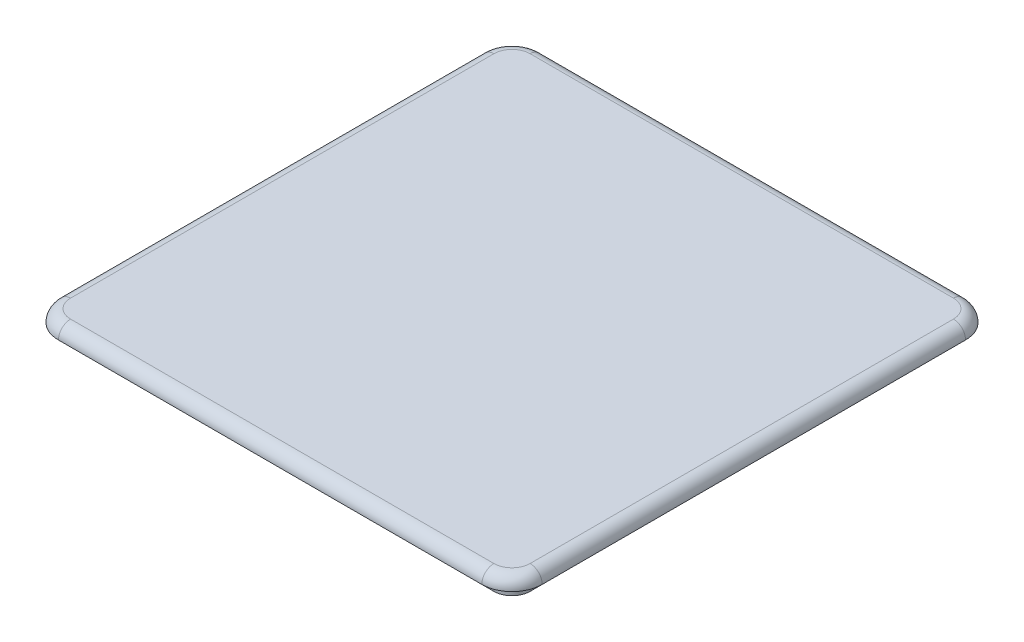
ISO-10303-21;
HEADER;
FILE_DESCRIPTION(('STEP AP214'),'2;1');
FILE_NAME('part.step','',(''),(''),'','','');
FILE_SCHEMA(('AUTOMOTIVE_DESIGN { 1 0 10303 214 1 1 1 1 }'));
ENDSEC;
DATA;
#1=APPLICATION_CONTEXT('core data for automotive mechanical design processes');
#2=APPLICATION_PROTOCOL_DEFINITION('international standard','automotive_design',2000,#1);
#3=PRODUCT_CONTEXT('',#1,'mechanical');
#4=PRODUCT('Part','Part','',(#3));
#5=PRODUCT_RELATED_PRODUCT_CATEGORY('part','',(#4));
#6=PRODUCT_DEFINITION_FORMATION('','',#4);
#7=PRODUCT_DEFINITION_CONTEXT('part definition',#1,'design');
#8=PRODUCT_DEFINITION('design','',#6,#7);
#9=PRODUCT_DEFINITION_SHAPE('','',#8);
#10=(LENGTH_UNIT() NAMED_UNIT(*) SI_UNIT(.MILLI.,.METRE.));
#11=(NAMED_UNIT(*) PLANE_ANGLE_UNIT() SI_UNIT($,.RADIAN.));
#12=(NAMED_UNIT(*) SI_UNIT($,.STERADIAN.) SOLID_ANGLE_UNIT());
#13=UNCERTAINTY_MEASURE_WITH_UNIT(LENGTH_MEASURE(1.E-05),#10,'distance_accuracy_value','');
#14=(GEOMETRIC_REPRESENTATION_CONTEXT(3) GLOBAL_UNCERTAINTY_ASSIGNED_CONTEXT((#13)) GLOBAL_UNIT_ASSIGNED_CONTEXT((#10,
#11,#12)) REPRESENTATION_CONTEXT('',''));
#15=CARTESIAN_POINT('',(0.,0.,0.));
#16=DIRECTION('',(0.,0.,1.));
#17=DIRECTION('',(1.,0.,0.));
#18=AXIS2_PLACEMENT_3D('',#15,#16,#17);
#19=CARTESIAN_POINT('',(-44.45,0.,44.45));
#20=DIRECTION('',(0.,1.,0.));
#21=DIRECTION('',(0.,0.,1.));
#22=AXIS2_PLACEMENT_3D('',#19,#20,#21);
#23=PLANE('',#22);
#24=CARTESIAN_POINT('',(-44.45,0.,44.45));
#25=DIRECTION('',(0.,1.,0.));
#26=DIRECTION('',(0.,0.,1.));
#27=AXIS2_PLACEMENT_3D('',#24,#25,#26);
#28=CIRCLE('',#27,6.35);
#29=CARTESIAN_POINT('',(-50.8,0.,44.45));
#30=VERTEX_POINT('',#29);
#31=CARTESIAN_POINT('',(-44.45,0.,50.8));
#32=VERTEX_POINT('',#31);
#33=EDGE_CURVE('E175',#30,#32,#28,.T.);
#34=ORIENTED_EDGE('',*,*,#33,.F.);
#35=DIRECTION('',(0.,0.,1.));
#36=VECTOR('',#35,1.);
#37=CARTESIAN_POINT('',(-50.8,0.,-44.45));
#38=LINE('',#37,#36);
#39=CARTESIAN_POINT('',(-50.8,0.,-44.45));
#40=VERTEX_POINT('',#39);
#41=EDGE_CURVE('E201',#40,#30,#38,.T.);
#42=ORIENTED_EDGE('',*,*,#41,.F.);
#43=CARTESIAN_POINT('',(-44.45,0.,-44.45));
#44=DIRECTION('',(0.,1.,0.));
#45=DIRECTION('',(0.,0.,1.));
#46=AXIS2_PLACEMENT_3D('',#43,#44,#45);
#47=CIRCLE('',#46,6.35);
#48=CARTESIAN_POINT('',(-44.45,0.,-50.8));
#49=VERTEX_POINT('',#48);
#50=EDGE_CURVE('E198',#49,#40,#47,.T.);
#51=ORIENTED_EDGE('',*,*,#50,.F.);
#52=DIRECTION('',(-1.,0.,0.));
#53=VECTOR('',#52,1.);
#54=CARTESIAN_POINT('',(-44.45,0.,-50.8));
#55=LINE('',#54,#53);
#56=CARTESIAN_POINT('',(44.4499999999999,0.,-50.8));
#57=VERTEX_POINT('',#56);
#58=EDGE_CURVE('E195',#57,#49,#55,.T.);
#59=ORIENTED_EDGE('',*,*,#58,.F.);
#60=CARTESIAN_POINT('',(44.45,0.,-44.45));
#61=DIRECTION('',(0.,1.,0.));
#62=DIRECTION('',(0.,0.,1.));
#63=AXIS2_PLACEMENT_3D('',#60,#61,#62);
#64=CIRCLE('',#63,6.35);
#65=CARTESIAN_POINT('',(50.8,0.,-44.45));
#66=VERTEX_POINT('',#65);
#67=EDGE_CURVE('E192',#66,#57,#64,.T.);
#68=ORIENTED_EDGE('',*,*,#67,.F.);
#69=DIRECTION('',(0.,0.,-1.));
#70=VECTOR('',#69,1.);
#71=CARTESIAN_POINT('',(50.8,0.,-44.45));
#72=LINE('',#71,#70);
#73=CARTESIAN_POINT('',(50.8,0.,44.45));
#74=VERTEX_POINT('',#73);
#75=EDGE_CURVE('E189',#74,#66,#72,.T.);
#76=ORIENTED_EDGE('',*,*,#75,.F.);
#77=CARTESIAN_POINT('',(44.45,0.,44.45));
#78=DIRECTION('',(0.,1.,0.));
#79=DIRECTION('',(0.,0.,1.));
#80=AXIS2_PLACEMENT_3D('',#77,#78,#79);
#81=CIRCLE('',#80,6.34999999999999);
#82=CARTESIAN_POINT('',(44.45,0.,50.8));
#83=VERTEX_POINT('',#82);
#84=EDGE_CURVE('E186',#83,#74,#81,.T.);
#85=ORIENTED_EDGE('',*,*,#84,.F.);
#86=DIRECTION('',(1.,0.,0.));
#87=VECTOR('',#86,1.);
#88=CARTESIAN_POINT('',(-44.45,0.,50.8));
#89=LINE('',#88,#87);
#90=EDGE_CURVE('E178',#32,#83,#89,.T.);
#91=ORIENTED_EDGE('',*,*,#90,.F.);
#92=EDGE_LOOP('',(#34,#42,#51,#59,#68,#76,#85,#91));
#93=FACE_BOUND('',#92,.T.);
#94=CARTESIAN_POINT('',(-44.45,0.,44.45));
#95=DIRECTION('',(0.,-1.,0.));
#96=DIRECTION('',(0.,0.,-1.));
#97=AXIS2_PLACEMENT_3D('',#94,#95,#96);
#98=CIRCLE('',#97,3.81);
#99=CARTESIAN_POINT('',(-44.45,0.,48.26));
#100=VERTEX_POINT('',#99);
#101=CARTESIAN_POINT('',(-48.26,0.,44.45));
#102=VERTEX_POINT('',#101);
#103=EDGE_CURVE('E174',#100,#102,#98,.T.);
#104=ORIENTED_EDGE('',*,*,#103,.F.);
#105=DIRECTION('',(-1.,0.,0.));
#106=VECTOR('',#105,1.);
#107=CARTESIAN_POINT('',(44.45,0.,48.26));
#108=LINE('',#107,#106);
#109=CARTESIAN_POINT('',(44.45,0.,48.26));
#110=VERTEX_POINT('',#109);
#111=EDGE_CURVE('E171',#110,#100,#108,.T.);
#112=ORIENTED_EDGE('',*,*,#111,.F.);
#113=CARTESIAN_POINT('',(44.45,0.,44.45));
#114=DIRECTION('',(0.,-1.,0.));
#115=DIRECTION('',(0.,0.,-1.));
#116=AXIS2_PLACEMENT_3D('',#113,#114,#115);
#117=CIRCLE('',#116,3.80999999999999);
#118=CARTESIAN_POINT('',(48.26,0.,44.45));
#119=VERTEX_POINT('',#118);
#120=EDGE_CURVE('E258',#119,#110,#117,.T.);
#121=ORIENTED_EDGE('',*,*,#120,.F.);
#122=DIRECTION('',(0.,0.,1.));
#123=VECTOR('',#122,1.);
#124=CARTESIAN_POINT('',(48.26,0.,-44.45));
#125=LINE('',#124,#123);
#126=CARTESIAN_POINT('',(48.26,0.,-44.45));
#127=VERTEX_POINT('',#126);
#128=EDGE_CURVE('E255',#127,#119,#125,.T.);
#129=ORIENTED_EDGE('',*,*,#128,.F.);
#130=CARTESIAN_POINT('',(44.45,0.,-44.45));
#131=DIRECTION('',(0.,-1.,0.));
#132=DIRECTION('',(0.,0.,-1.));
#133=AXIS2_PLACEMENT_3D('',#130,#131,#132);
#134=CIRCLE('',#133,3.81);
#135=CARTESIAN_POINT('',(44.4499999999999,0.,-48.26));
#136=VERTEX_POINT('',#135);
#137=EDGE_CURVE('E252',#136,#127,#134,.T.);
#138=ORIENTED_EDGE('',*,*,#137,.F.);
#139=DIRECTION('',(1.,0.,0.));
#140=VECTOR('',#139,1.);
#141=CARTESIAN_POINT('',(-44.45,0.,-48.26));
#142=LINE('',#141,#140);
#143=CARTESIAN_POINT('',(-44.45,0.,-48.26));
#144=VERTEX_POINT('',#143);
#145=EDGE_CURVE('E249',#144,#136,#142,.T.);
#146=ORIENTED_EDGE('',*,*,#145,.F.);
#147=CARTESIAN_POINT('',(-44.45,0.,-44.45));
#148=DIRECTION('',(0.,-1.,0.));
#149=DIRECTION('',(0.,0.,-1.));
#150=AXIS2_PLACEMENT_3D('',#147,#148,#149);
#151=CIRCLE('',#150,3.81);
#152=CARTESIAN_POINT('',(-48.26,0.,-44.45));
#153=VERTEX_POINT('',#152);
#154=EDGE_CURVE('E242',#153,#144,#151,.T.);
#155=ORIENTED_EDGE('',*,*,#154,.F.);
#156=DIRECTION('',(0.,0.,-1.));
#157=VECTOR('',#156,1.);
#158=CARTESIAN_POINT('',(-48.26,0.,44.45));
#159=LINE('',#158,#157);
#160=EDGE_CURVE('E240',#102,#153,#159,.T.);
#161=ORIENTED_EDGE('',*,*,#160,.F.);
#162=EDGE_LOOP('',(#104,#112,#121,#129,#138,#146,#155,#161));
#163=FACE_BOUND('',#162,.T.);
#164=ADVANCED_FACE('F37',(#93,#163),#23,.F.);
#165=CARTESIAN_POINT('',(-44.45,2.54,44.45));
#166=DIRECTION('',(0.,1.,0.));
#167=DIRECTION('',(0.,0.,1.));
#168=AXIS2_PLACEMENT_3D('',#165,#166,#167);
#169=PLANE('',#168);
#170=DIRECTION('',(0.,0.,-1.));
#171=VECTOR('',#170,1.);
#172=CARTESIAN_POINT('',(48.26,2.54,-44.4499999999999));
#173=LINE('',#172,#171);
#174=CARTESIAN_POINT('',(48.26,2.54,44.45));
#175=VERTEX_POINT('',#174);
#176=CARTESIAN_POINT('',(48.26,2.54,-44.45));
#177=VERTEX_POINT('',#176);
#178=EDGE_CURVE('E46',#175,#177,#173,.T.);
#179=ORIENTED_EDGE('',*,*,#178,.T.);
#180=CARTESIAN_POINT('',(44.45,2.54,-44.45));
#181=DIRECTION('',(0.,1.,0.));
#182=DIRECTION('',(0.,0.,1.));
#183=AXIS2_PLACEMENT_3D('',#180,#181,#182);
#184=CIRCLE('',#183,3.81);
#185=CARTESIAN_POINT('',(44.45,2.54,-48.26));
#186=VERTEX_POINT('',#185);
#187=EDGE_CURVE('E11',#177,#186,#184,.T.);
#188=ORIENTED_EDGE('',*,*,#187,.T.);
#189=DIRECTION('',(-1.,0.,0.));
#190=VECTOR('',#189,1.);
#191=CARTESIAN_POINT('',(-44.45,2.54,-48.26));
#192=LINE('',#191,#190);
#193=CARTESIAN_POINT('',(-44.45,2.54,-48.26));
#194=VERTEX_POINT('',#193);
#195=EDGE_CURVE('E204',#186,#194,#192,.T.);
#196=ORIENTED_EDGE('',*,*,#195,.T.);
#197=CARTESIAN_POINT('',(-44.45,2.54,-44.45));
#198=DIRECTION('',(0.,1.,0.));
#199=DIRECTION('',(0.,0.,1.));
#200=AXIS2_PLACEMENT_3D('',#197,#198,#199);
#201=CIRCLE('',#200,3.81);
#202=CARTESIAN_POINT('',(-48.26,2.54,-44.45));
#203=VERTEX_POINT('',#202);
#204=EDGE_CURVE('E206',#194,#203,#201,.T.);
#205=ORIENTED_EDGE('',*,*,#204,.T.);
#206=DIRECTION('',(0.,0.,1.));
#207=VECTOR('',#206,1.);
#208=CARTESIAN_POINT('',(-48.26,2.54,44.45));
#209=LINE('',#208,#207);
#210=CARTESIAN_POINT('',(-48.26,2.54,44.45));
#211=VERTEX_POINT('',#210);
#212=EDGE_CURVE('E208',#203,#211,#209,.T.);
#213=ORIENTED_EDGE('',*,*,#212,.T.);
#214=CARTESIAN_POINT('',(-44.45,2.54,44.45));
#215=DIRECTION('',(0.,1.,0.));
#216=DIRECTION('',(0.,0.,1.));
#217=AXIS2_PLACEMENT_3D('',#214,#215,#216);
#218=CIRCLE('',#217,3.81);
#219=CARTESIAN_POINT('',(-44.45,2.54,48.26));
#220=VERTEX_POINT('',#219);
#221=EDGE_CURVE('E210',#211,#220,#218,.T.);
#222=ORIENTED_EDGE('',*,*,#221,.T.);
#223=DIRECTION('',(1.,0.,0.));
#224=VECTOR('',#223,1.);
#225=CARTESIAN_POINT('',(44.45,2.54,48.26));
#226=LINE('',#225,#224);
#227=CARTESIAN_POINT('',(44.45,2.54,48.26));
#228=VERTEX_POINT('',#227);
#229=EDGE_CURVE('E212',#220,#228,#226,.T.);
#230=ORIENTED_EDGE('',*,*,#229,.T.);
#231=CARTESIAN_POINT('',(44.45,2.54,44.45));
#232=DIRECTION('',(0.,1.,0.));
#233=DIRECTION('',(0.,0.,1.));
#234=AXIS2_PLACEMENT_3D('',#231,#232,#233);
#235=CIRCLE('',#234,3.80999999999999);
#236=EDGE_CURVE('E57',#228,#175,#235,.T.);
#237=ORIENTED_EDGE('',*,*,#236,.T.);
#238=EDGE_LOOP('',(#179,#188,#196,#205,#213,#222,#230,#237));
#239=FACE_BOUND('',#238,.T.);
#240=ADVANCED_FACE('F316',(#239),#169,.T.);
#241=CARTESIAN_POINT('',(-44.45,-2.54,44.45));
#242=DIRECTION('',(0.,1.,0.));
#243=DIRECTION('',(0.,0.,1.));
#244=AXIS2_PLACEMENT_3D('',#241,#242,#243);
#245=CYLINDRICAL_SURFACE('',#244,3.81);
#246=ORIENTED_EDGE('',*,*,#103,.T.);
#247=DIRECTION('',(0.,1.,0.));
#248=VECTOR('',#247,1.);
#249=CARTESIAN_POINT('',(-48.26,-2.54,44.45));
#250=LINE('',#249,#248);
#251=CARTESIAN_POINT('',(-48.26,-2.54,44.45));
#252=VERTEX_POINT('',#251);
#253=EDGE_CURVE('E155',#252,#102,#250,.T.);
#254=ORIENTED_EDGE('',*,*,#253,.F.);
#255=CARTESIAN_POINT('',(-44.45,-2.54,44.45));
#256=DIRECTION('',(0.,-1.,0.));
#257=DIRECTION('',(0.,0.,-1.));
#258=AXIS2_PLACEMENT_3D('',#255,#256,#257);
#259=CIRCLE('',#258,3.81);
#260=CARTESIAN_POINT('',(-44.45,-2.54,48.26));
#261=VERTEX_POINT('',#260);
#262=EDGE_CURVE('E162',#261,#252,#259,.T.);
#263=ORIENTED_EDGE('',*,*,#262,.F.);
#264=DIRECTION('',(0.,1.,0.));
#265=VECTOR('',#264,1.);
#266=CARTESIAN_POINT('',(-44.45,-2.54,48.26));
#267=LINE('',#266,#265);
#268=EDGE_CURVE('E263',#261,#100,#267,.T.);
#269=ORIENTED_EDGE('',*,*,#268,.T.);
#270=EDGE_LOOP('',(#246,#254,#263,#269));
#271=FACE_BOUND('',#270,.T.);
#272=ADVANCED_FACE('F173',(#271),#245,.T.);
#273=CARTESIAN_POINT('',(-48.26,-2.54,44.45));
#274=DIRECTION('',(1.,0.,0.));
#275=DIRECTION('',(0.,0.,-1.));
#276=AXIS2_PLACEMENT_3D('',#273,#274,#275);
#277=PLANE('',#276);
#278=ORIENTED_EDGE('',*,*,#160,.T.);
#279=DIRECTION('',(0.,1.,0.));
#280=VECTOR('',#279,1.);
#281=CARTESIAN_POINT('',(-48.26,-2.54,-44.45));
#282=LINE('',#281,#280);
#283=CARTESIAN_POINT('',(-48.26,-2.54,-44.45));
#284=VERTEX_POINT('',#283);
#285=EDGE_CURVE('E158',#284,#153,#282,.T.);
#286=ORIENTED_EDGE('',*,*,#285,.F.);
#287=DIRECTION('',(0.,0.,-1.));
#288=VECTOR('',#287,1.);
#289=CARTESIAN_POINT('',(-48.26,-2.54,44.45));
#290=LINE('',#289,#288);
#291=EDGE_CURVE('E150',#252,#284,#290,.T.);
#292=ORIENTED_EDGE('',*,*,#291,.F.);
#293=ORIENTED_EDGE('',*,*,#253,.T.);
#294=EDGE_LOOP('',(#278,#286,#292,#293));
#295=FACE_BOUND('',#294,.T.);
#296=ADVANCED_FACE('F153',(#295),#277,.F.);
#297=CARTESIAN_POINT('',(-44.45,-2.54,-44.45));
#298=DIRECTION('',(0.,1.,0.));
#299=DIRECTION('',(0.,0.,1.));
#300=AXIS2_PLACEMENT_3D('',#297,#298,#299);
#301=CYLINDRICAL_SURFACE('',#300,3.81);
#302=ORIENTED_EDGE('',*,*,#154,.T.);
#303=DIRECTION('',(0.,1.,0.));
#304=VECTOR('',#303,1.);
#305=CARTESIAN_POINT('',(-44.45,-2.54,-48.26));
#306=LINE('',#305,#304);
#307=CARTESIAN_POINT('',(-44.45,-2.54,-48.26));
#308=VERTEX_POINT('',#307);
#309=EDGE_CURVE('E180',#308,#144,#306,.T.);
#310=ORIENTED_EDGE('',*,*,#309,.F.);
#311=CARTESIAN_POINT('',(-44.45,-2.54,-44.45));
#312=DIRECTION('',(0.,-1.,0.));
#313=DIRECTION('',(0.,0.,-1.));
#314=AXIS2_PLACEMENT_3D('',#311,#312,#313);
#315=CIRCLE('',#314,3.81);
#316=EDGE_CURVE('E161',#284,#308,#315,.T.);
#317=ORIENTED_EDGE('',*,*,#316,.F.);
#318=ORIENTED_EDGE('',*,*,#285,.T.);
#319=EDGE_LOOP('',(#302,#310,#317,#318));
#320=FACE_BOUND('',#319,.T.);
#321=ADVANCED_FACE('F284',(#320),#301,.T.);
#322=CARTESIAN_POINT('',(-44.45,-2.54,-48.26));
#323=DIRECTION('',(0.,0.,1.));
#324=DIRECTION('',(1.,0.,0.));
#325=AXIS2_PLACEMENT_3D('',#322,#323,#324);
#326=PLANE('',#325);
#327=ORIENTED_EDGE('',*,*,#145,.T.);
#328=DIRECTION('',(0.,1.,0.));
#329=VECTOR('',#328,1.);
#330=CARTESIAN_POINT('',(44.4499999999999,-2.54,-48.26));
#331=LINE('',#330,#329);
#332=CARTESIAN_POINT('',(44.4499999999999,-2.54,-48.26));
#333=VERTEX_POINT('',#332);
#334=EDGE_CURVE('E274',#333,#136,#331,.T.);
#335=ORIENTED_EDGE('',*,*,#334,.F.);
#336=DIRECTION('',(1.,0.,0.));
#337=VECTOR('',#336,1.);
#338=CARTESIAN_POINT('',(-44.45,-2.54,-48.26));
#339=LINE('',#338,#337);
#340=EDGE_CURVE('E282',#308,#333,#339,.T.);
#341=ORIENTED_EDGE('',*,*,#340,.F.);
#342=ORIENTED_EDGE('',*,*,#309,.T.);
#343=EDGE_LOOP('',(#327,#335,#341,#342));
#344=FACE_BOUND('',#343,.T.);
#345=ADVANCED_FACE('F280',(#344),#326,.F.);
#346=CARTESIAN_POINT('',(44.45,-2.54,-44.45));
#347=DIRECTION('',(0.,1.,0.));
#348=DIRECTION('',(0.,0.,1.));
#349=AXIS2_PLACEMENT_3D('',#346,#347,#348);
#350=CYLINDRICAL_SURFACE('',#349,3.81);
#351=ORIENTED_EDGE('',*,*,#137,.T.);
#352=DIRECTION('',(0.,1.,0.));
#353=VECTOR('',#352,1.);
#354=CARTESIAN_POINT('',(48.26,-2.54,-44.45));
#355=LINE('',#354,#353);
#356=CARTESIAN_POINT('',(48.26,-2.54,-44.45));
#357=VERTEX_POINT('',#356);
#358=EDGE_CURVE('E271',#357,#127,#355,.T.);
#359=ORIENTED_EDGE('',*,*,#358,.F.);
#360=CARTESIAN_POINT('',(44.45,-2.54,-44.45));
#361=DIRECTION('',(0.,-1.,0.));
#362=DIRECTION('',(0.,0.,-1.));
#363=AXIS2_PLACEMENT_3D('',#360,#361,#362);
#364=CIRCLE('',#363,3.81);
#365=EDGE_CURVE('E297',#333,#357,#364,.T.);
#366=ORIENTED_EDGE('',*,*,#365,.F.);
#367=ORIENTED_EDGE('',*,*,#334,.T.);
#368=EDGE_LOOP('',(#351,#359,#366,#367));
#369=FACE_BOUND('',#368,.T.);
#370=ADVANCED_FACE('F288',(#369),#350,.T.);
#371=CARTESIAN_POINT('',(48.26,-2.54,-44.45));
#372=DIRECTION('',(-1.,0.,0.));
#373=DIRECTION('',(0.,0.,1.));
#374=AXIS2_PLACEMENT_3D('',#371,#372,#373);
#375=PLANE('',#374);
#376=ORIENTED_EDGE('',*,*,#128,.T.);
#377=DIRECTION('',(0.,1.,0.));
#378=VECTOR('',#377,1.);
#379=CARTESIAN_POINT('',(48.26,-2.54,44.45));
#380=LINE('',#379,#378);
#381=CARTESIAN_POINT('',(48.26,-2.54,44.45));
#382=VERTEX_POINT('',#381);
#383=EDGE_CURVE('E268',#382,#119,#380,.T.);
#384=ORIENTED_EDGE('',*,*,#383,.F.);
#385=DIRECTION('',(0.,0.,1.));
#386=VECTOR('',#385,1.);
#387=CARTESIAN_POINT('',(48.26,-2.54,-44.45));
#388=LINE('',#387,#386);
#389=EDGE_CURVE('E294',#357,#382,#388,.T.);
#390=ORIENTED_EDGE('',*,*,#389,.F.);
#391=ORIENTED_EDGE('',*,*,#358,.T.);
#392=EDGE_LOOP('',(#376,#384,#390,#391));
#393=FACE_BOUND('',#392,.T.);
#394=ADVANCED_FACE('F292',(#393),#375,.F.);
#395=CARTESIAN_POINT('',(44.45,-2.54,44.45));
#396=DIRECTION('',(0.,1.,0.));
#397=DIRECTION('',(0.,0.,1.));
#398=AXIS2_PLACEMENT_3D('',#395,#396,#397);
#399=CYLINDRICAL_SURFACE('',#398,3.80999999999999);
#400=ORIENTED_EDGE('',*,*,#120,.T.);
#401=DIRECTION('',(0.,1.,0.));
#402=VECTOR('',#401,1.);
#403=CARTESIAN_POINT('',(44.45,-2.54,48.26));
#404=LINE('',#403,#402);
#405=CARTESIAN_POINT('',(44.45,-2.54,48.26));
#406=VERTEX_POINT('',#405);
#407=EDGE_CURVE('E265',#406,#110,#404,.T.);
#408=ORIENTED_EDGE('',*,*,#407,.F.);
#409=CARTESIAN_POINT('',(44.45,-2.54,44.45));
#410=DIRECTION('',(0.,-1.,0.));
#411=DIRECTION('',(0.,0.,-1.));
#412=AXIS2_PLACEMENT_3D('',#409,#410,#411);
#413=CIRCLE('',#412,3.80999999999999);
#414=EDGE_CURVE('E296',#382,#406,#413,.T.);
#415=ORIENTED_EDGE('',*,*,#414,.F.);
#416=ORIENTED_EDGE('',*,*,#383,.T.);
#417=EDGE_LOOP('',(#400,#408,#415,#416));
#418=FACE_BOUND('',#417,.T.);
#419=ADVANCED_FACE('F304',(#418),#399,.T.);
#420=CARTESIAN_POINT('',(44.45,-2.54,48.26));
#421=DIRECTION('',(0.,0.,-1.));
#422=DIRECTION('',(-1.,0.,0.));
#423=AXIS2_PLACEMENT_3D('',#420,#421,#422);
#424=PLANE('',#423);
#425=ORIENTED_EDGE('',*,*,#111,.T.);
#426=ORIENTED_EDGE('',*,*,#268,.F.);
#427=DIRECTION('',(-1.,0.,0.));
#428=VECTOR('',#427,1.);
#429=CARTESIAN_POINT('',(44.45,-2.54,48.26));
#430=LINE('',#429,#428);
#431=EDGE_CURVE('E167',#406,#261,#430,.T.);
#432=ORIENTED_EDGE('',*,*,#431,.F.);
#433=ORIENTED_EDGE('',*,*,#407,.T.);
#434=EDGE_LOOP('',(#425,#426,#432,#433));
#435=FACE_BOUND('',#434,.T.);
#436=ADVANCED_FACE('F306',(#435),#424,.F.);
#437=CARTESIAN_POINT('',(-44.45,-2.54,44.45));
#438=DIRECTION('',(0.,-1.,0.));
#439=DIRECTION('',(0.,0.,-1.));
#440=AXIS2_PLACEMENT_3D('',#437,#438,#439);
#441=PLANE('',#440);
#442=ORIENTED_EDGE('',*,*,#262,.T.);
#443=ORIENTED_EDGE('',*,*,#291,.T.);
#444=ORIENTED_EDGE('',*,*,#316,.T.);
#445=ORIENTED_EDGE('',*,*,#340,.T.);
#446=ORIENTED_EDGE('',*,*,#365,.T.);
#447=ORIENTED_EDGE('',*,*,#389,.T.);
#448=ORIENTED_EDGE('',*,*,#414,.T.);
#449=ORIENTED_EDGE('',*,*,#431,.T.);
#450=EDGE_LOOP('',(#442,#443,#444,#445,#446,#447,#448,#449));
#451=FACE_BOUND('',#450,.T.);
#452=ADVANCED_FACE('F165',(#451),#441,.T.);
#453=CARTESIAN_POINT('',(-44.45,0.,44.45));
#454=DIRECTION('',(0.,1.,0.));
#455=DIRECTION('',(0.,0.,1.));
#456=AXIS2_PLACEMENT_3D('',#453,#454,#455);
#457=TOROIDAL_SURFACE('',#456,3.81,2.54);
#458=CARTESIAN_POINT('',(-48.26,0.,44.45));
#459=DIRECTION('',(0.,0.,-1.));
#460=DIRECTION('',(-1.,0.,0.));
#461=AXIS2_PLACEMENT_3D('',#458,#459,#460);
#462=CIRCLE('',#461,2.54);
#463=EDGE_CURVE('E231',#30,#211,#462,.T.);
#464=ORIENTED_EDGE('',*,*,#463,.F.);
#465=ORIENTED_EDGE('',*,*,#33,.T.);
#466=CARTESIAN_POINT('',(-44.45,0.,48.26));
#467=DIRECTION('',(1.,0.,0.));
#468=DIRECTION('',(0.,0.,-1.));
#469=AXIS2_PLACEMENT_3D('',#466,#467,#468);
#470=CIRCLE('',#469,2.54);
#471=EDGE_CURVE('E41',#220,#32,#470,.T.);
#472=ORIENTED_EDGE('',*,*,#471,.F.);
#473=ORIENTED_EDGE('',*,*,#221,.F.);
#474=EDGE_LOOP('',(#464,#465,#472,#473));
#475=FACE_BOUND('',#474,.T.);
#476=ADVANCED_FACE('F39',(#475),#457,.T.);
#477=CARTESIAN_POINT('',(-44.45,0.,48.26));
#478=DIRECTION('',(-1.,0.,0.));
#479=DIRECTION('',(0.,0.,1.));
#480=AXIS2_PLACEMENT_3D('',#477,#478,#479);
#481=CYLINDRICAL_SURFACE('',#480,2.54);
#482=ORIENTED_EDGE('',*,*,#471,.T.);
#483=ORIENTED_EDGE('',*,*,#90,.T.);
#484=CARTESIAN_POINT('',(44.45,0.,48.26));
#485=DIRECTION('',(1.,0.,0.));
#486=DIRECTION('',(0.,0.,-1.));
#487=AXIS2_PLACEMENT_3D('',#484,#485,#486);
#488=CIRCLE('',#487,2.54);
#489=EDGE_CURVE('E229',#228,#83,#488,.T.);
#490=ORIENTED_EDGE('',*,*,#489,.F.);
#491=ORIENTED_EDGE('',*,*,#229,.F.);
#492=EDGE_LOOP('',(#482,#483,#490,#491));
#493=FACE_BOUND('',#492,.T.);
#494=ADVANCED_FACE('F347',(#493),#481,.T.);
#495=CARTESIAN_POINT('',(-48.26,0.,44.45));
#496=DIRECTION('',(0.,0.,-1.));
#497=DIRECTION('',(-1.,0.,0.));
#498=AXIS2_PLACEMENT_3D('',#495,#496,#497);
#499=CYLINDRICAL_SURFACE('',#498,2.54);
#500=ORIENTED_EDGE('',*,*,#463,.T.);
#501=ORIENTED_EDGE('',*,*,#212,.F.);
#502=CARTESIAN_POINT('',(-48.26,0.,-44.45));
#503=DIRECTION('',(0.,0.,-1.));
#504=DIRECTION('',(-1.,0.,0.));
#505=AXIS2_PLACEMENT_3D('',#502,#503,#504);
#506=CIRCLE('',#505,2.54);
#507=EDGE_CURVE('E226',#40,#203,#506,.T.);
#508=ORIENTED_EDGE('',*,*,#507,.F.);
#509=ORIENTED_EDGE('',*,*,#41,.T.);
#510=EDGE_LOOP('',(#500,#501,#508,#509));
#511=FACE_BOUND('',#510,.T.);
#512=ADVANCED_FACE('F344',(#511),#499,.T.);
#513=CARTESIAN_POINT('',(44.45,0.,44.45));
#514=DIRECTION('',(0.,1.,0.));
#515=DIRECTION('',(0.,0.,1.));
#516=AXIS2_PLACEMENT_3D('',#513,#514,#515);
#517=TOROIDAL_SURFACE('',#516,3.80999999999999,2.54);
#518=ORIENTED_EDGE('',*,*,#489,.T.);
#519=ORIENTED_EDGE('',*,*,#84,.T.);
#520=CARTESIAN_POINT('',(48.26,0.,44.45));
#521=DIRECTION('',(0.,0.,-1.));
#522=DIRECTION('',(-1.,0.,0.));
#523=AXIS2_PLACEMENT_3D('',#520,#521,#522);
#524=CIRCLE('',#523,2.54);
#525=EDGE_CURVE('E223',#175,#74,#524,.T.);
#526=ORIENTED_EDGE('',*,*,#525,.F.);
#527=ORIENTED_EDGE('',*,*,#236,.F.);
#528=EDGE_LOOP('',(#518,#519,#526,#527));
#529=FACE_BOUND('',#528,.T.);
#530=ADVANCED_FACE('F340',(#529),#517,.T.);
#531=CARTESIAN_POINT('',(-44.45,0.,-44.45));
#532=DIRECTION('',(0.,1.,0.));
#533=DIRECTION('',(0.,0.,1.));
#534=AXIS2_PLACEMENT_3D('',#531,#532,#533);
#535=TOROIDAL_SURFACE('',#534,3.81,2.54);
#536=ORIENTED_EDGE('',*,*,#507,.T.);
#537=ORIENTED_EDGE('',*,*,#204,.F.);
#538=CARTESIAN_POINT('',(-44.45,0.,-48.26));
#539=DIRECTION('',(1.,0.,0.));
#540=DIRECTION('',(0.,0.,-1.));
#541=AXIS2_PLACEMENT_3D('',#538,#539,#540);
#542=CIRCLE('',#541,2.54);
#543=EDGE_CURVE('E220',#49,#194,#542,.T.);
#544=ORIENTED_EDGE('',*,*,#543,.F.);
#545=ORIENTED_EDGE('',*,*,#50,.T.);
#546=EDGE_LOOP('',(#536,#537,#544,#545));
#547=FACE_BOUND('',#546,.T.);
#548=ADVANCED_FACE('F336',(#547),#535,.T.);
#549=CARTESIAN_POINT('',(48.26,0.,44.45));
#550=DIRECTION('',(0.,0.,1.));
#551=DIRECTION('',(1.,0.,0.));
#552=AXIS2_PLACEMENT_3D('',#549,#550,#551);
#553=CYLINDRICAL_SURFACE('',#552,2.54);
#554=ORIENTED_EDGE('',*,*,#525,.T.);
#555=ORIENTED_EDGE('',*,*,#75,.T.);
#556=CARTESIAN_POINT('',(48.26,0.,-44.45));
#557=DIRECTION('',(0.,0.,-1.));
#558=DIRECTION('',(-1.,0.,0.));
#559=AXIS2_PLACEMENT_3D('',#556,#557,#558);
#560=CIRCLE('',#559,2.54);
#561=EDGE_CURVE('E218',#177,#66,#560,.T.);
#562=ORIENTED_EDGE('',*,*,#561,.F.);
#563=ORIENTED_EDGE('',*,*,#178,.F.);
#564=EDGE_LOOP('',(#554,#555,#562,#563));
#565=FACE_BOUND('',#564,.T.);
#566=ADVANCED_FACE('F332',(#565),#553,.T.);
#567=CARTESIAN_POINT('',(-44.45,0.,-48.26));
#568=DIRECTION('',(1.,0.,0.));
#569=DIRECTION('',(0.,0.,-1.));
#570=AXIS2_PLACEMENT_3D('',#567,#568,#569);
#571=CYLINDRICAL_SURFACE('',#570,2.54);
#572=ORIENTED_EDGE('',*,*,#543,.T.);
#573=ORIENTED_EDGE('',*,*,#195,.F.);
#574=CARTESIAN_POINT('',(44.4499999999999,0.,-48.26));
#575=DIRECTION('',(1.,0.,0.));
#576=DIRECTION('',(0.,1.,0.));
#577=AXIS2_PLACEMENT_3D('',#574,#575,#576);
#578=CIRCLE('',#577,2.54);
#579=EDGE_CURVE('E216',#57,#186,#578,.T.);
#580=ORIENTED_EDGE('',*,*,#579,.F.);
#581=ORIENTED_EDGE('',*,*,#58,.T.);
#582=EDGE_LOOP('',(#572,#573,#580,#581));
#583=FACE_BOUND('',#582,.T.);
#584=ADVANCED_FACE('F328',(#583),#571,.T.);
#585=CARTESIAN_POINT('',(44.45,0.,-44.45));
#586=DIRECTION('',(0.,1.,0.));
#587=DIRECTION('',(0.,0.,1.));
#588=AXIS2_PLACEMENT_3D('',#585,#586,#587);
#589=TOROIDAL_SURFACE('',#588,3.81,2.54);
#590=ORIENTED_EDGE('',*,*,#561,.T.);
#591=ORIENTED_EDGE('',*,*,#67,.T.);
#592=ORIENTED_EDGE('',*,*,#579,.T.);
#593=ORIENTED_EDGE('',*,*,#187,.F.);
#594=EDGE_LOOP('',(#590,#591,#592,#593));
#595=FACE_BOUND('',#594,.T.);
#596=ADVANCED_FACE('F325',(#595),#589,.T.);
#597=CLOSED_SHELL('',(#164,#240,#272,#296,#321,#345,#370,#394,#419,#436,#452,#476,#494,#512,
#530,#548,#566,#584,#596));
#598=MANIFOLD_SOLID_BREP('B2',#597);
#599=ADVANCED_BREP_SHAPE_REPRESENTATION('',(#18,#598),#14);
#600=SHAPE_DEFINITION_REPRESENTATION(#9,#599);
ENDSEC;
END-ISO-10303-21;
